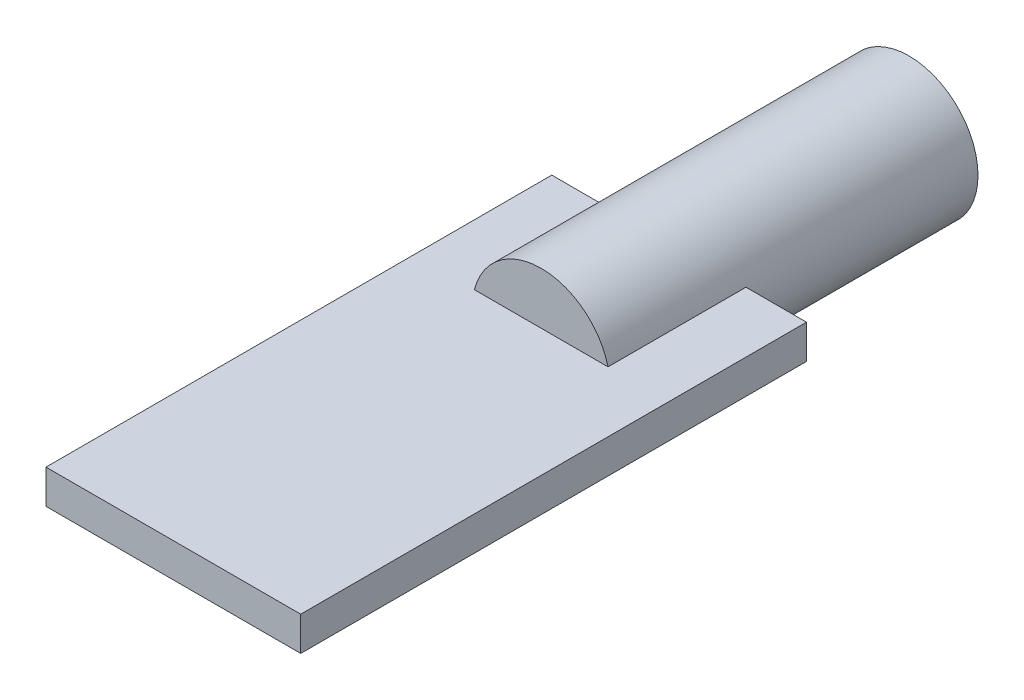
ISO-10303-21;
HEADER;
FILE_DESCRIPTION(('STEP AP214'),'2;1');
FILE_NAME('part.step','',(''),(''),'','','');
FILE_SCHEMA(('AUTOMOTIVE_DESIGN { 1 0 10303 214 1 1 1 1 }'));
ENDSEC;
DATA;
#1=APPLICATION_CONTEXT('core data for automotive mechanical design processes');
#2=APPLICATION_PROTOCOL_DEFINITION('international standard','automotive_design',2000,#1);
#3=PRODUCT_CONTEXT('',#1,'mechanical');
#4=PRODUCT('Part','Part','',(#3));
#5=PRODUCT_RELATED_PRODUCT_CATEGORY('part','',(#4));
#6=PRODUCT_DEFINITION_FORMATION('','',#4);
#7=PRODUCT_DEFINITION_CONTEXT('part definition',#1,'design');
#8=PRODUCT_DEFINITION('design','',#6,#7);
#9=PRODUCT_DEFINITION_SHAPE('','',#8);
#10=(LENGTH_UNIT() NAMED_UNIT(*) SI_UNIT(.MILLI.,.METRE.));
#11=(NAMED_UNIT(*) PLANE_ANGLE_UNIT() SI_UNIT($,.RADIAN.));
#12=(NAMED_UNIT(*) SI_UNIT($,.STERADIAN.) SOLID_ANGLE_UNIT());
#13=UNCERTAINTY_MEASURE_WITH_UNIT(LENGTH_MEASURE(1.E-05),#10,'distance_accuracy_value','');
#14=(GEOMETRIC_REPRESENTATION_CONTEXT(3) GLOBAL_UNCERTAINTY_ASSIGNED_CONTEXT((#13)) GLOBAL_UNIT_ASSIGNED_CONTEXT((#10,
#11,#12)) REPRESENTATION_CONTEXT('',''));
#15=CARTESIAN_POINT('',(0.,0.,0.));
#16=DIRECTION('',(0.,0.,1.));
#17=DIRECTION('',(1.,0.,0.));
#18=AXIS2_PLACEMENT_3D('',#15,#16,#17);
#19=CARTESIAN_POINT('',(0.,0.,40.));
#20=DIRECTION('',(0.,0.,1.));
#21=DIRECTION('',(1.,0.,0.));
#22=AXIS2_PLACEMENT_3D('',#19,#20,#21);
#23=PLANE('',#22);
#24=DIRECTION('',(1.,0.,0.));
#25=VECTOR('',#24,1.);
#26=CARTESIAN_POINT('',(0.,-1.85,40.));
#27=LINE('',#26,#25);
#28=CARTESIAN_POINT('',(-7.26825288497862,-1.85,40.));
#29=VERTEX_POINT('',#28);
#30=CARTESIAN_POINT('',(7.26825288497862,-1.85,40.));
#31=VERTEX_POINT('',#30);
#32=EDGE_CURVE('E144',#29,#31,#27,.T.);
#33=ORIENTED_EDGE('',*,*,#32,.F.);
#34=CARTESIAN_POINT('',(0.,0.,40.));
#35=DIRECTION('',(0.,0.,1.));
#36=DIRECTION('',(1.,0.,0.));
#37=AXIS2_PLACEMENT_3D('',#34,#35,#36);
#38=CIRCLE('',#37,7.5);
#39=EDGE_CURVE('E141',#29,#31,#38,.T.);
#40=ORIENTED_EDGE('',*,*,#39,.T.);
#41=EDGE_LOOP('',(#33,#40));
#42=FACE_BOUND('',#41,.T.);
#43=ADVANCED_FACE('F35',(#42),#23,.T.);
#44=CARTESIAN_POINT('',(0.,0.,40.));
#45=DIRECTION('',(0.,0.,-1.));
#46=DIRECTION('',(-1.,0.,0.));
#47=AXIS2_PLACEMENT_3D('',#44,#45,#46);
#48=CYLINDRICAL_SURFACE('',#47,7.5);
#49=CARTESIAN_POINT('',(0.,0.,25.));
#50=DIRECTION('',(0.,0.,-1.));
#51=DIRECTION('',(-1.,0.,0.));
#52=AXIS2_PLACEMENT_3D('',#49,#50,#51);
#53=CIRCLE('',#52,7.5);
#54=CARTESIAN_POINT('',(7.26825288497862,1.85,25.));
#55=VERTEX_POINT('',#54);
#56=CARTESIAN_POINT('',(7.26825288497862,-1.85,25.));
#57=VERTEX_POINT('',#56);
#58=EDGE_CURVE('E11',#55,#57,#53,.T.);
#59=ORIENTED_EDGE('',*,*,#58,.T.);
#60=DIRECTION('',(0.,0.,-1.));
#61=VECTOR('',#60,1.);
#62=CARTESIAN_POINT('',(7.26825288497862,-1.85,40.));
#63=LINE('',#62,#61);
#64=EDGE_CURVE('E134',#57,#31,#63,.F.);
#65=ORIENTED_EDGE('',*,*,#64,.T.);
#66=ORIENTED_EDGE('',*,*,#39,.F.);
#67=DIRECTION('',(0.,0.,-1.));
#68=VECTOR('',#67,1.);
#69=CARTESIAN_POINT('',(-7.26825288497862,-1.85,40.));
#70=LINE('',#69,#68);
#71=CARTESIAN_POINT('',(-7.26825288497862,-1.85,25.));
#72=VERTEX_POINT('',#71);
#73=EDGE_CURVE('E136',#29,#72,#70,.T.);
#74=ORIENTED_EDGE('',*,*,#73,.T.);
#75=CARTESIAN_POINT('',(-7.26825288497862,1.85,25.));
#76=VERTEX_POINT('',#75);
#77=EDGE_CURVE('E39',#72,#76,#53,.T.);
#78=ORIENTED_EDGE('',*,*,#77,.T.);
#79=DIRECTION('',(0.,0.,-1.));
#80=VECTOR('',#79,1.);
#81=CARTESIAN_POINT('',(-7.26825288497862,1.85,40.));
#82=LINE('',#81,#80);
#83=CARTESIAN_POINT('',(-7.26825288497862,1.85,40.));
#84=VERTEX_POINT('',#83);
#85=EDGE_CURVE('E124',#76,#84,#82,.F.);
#86=ORIENTED_EDGE('',*,*,#85,.T.);
#87=CARTESIAN_POINT('',(7.26825288497862,1.85,40.));
#88=VERTEX_POINT('',#87);
#89=EDGE_CURVE('E139',#88,#84,#38,.T.);
#90=ORIENTED_EDGE('',*,*,#89,.F.);
#91=DIRECTION('',(0.,0.,-1.));
#92=VECTOR('',#91,1.);
#93=CARTESIAN_POINT('',(7.26825288497862,1.85,40.));
#94=LINE('',#93,#92);
#95=EDGE_CURVE('E127',#88,#55,#94,.T.);
#96=ORIENTED_EDGE('',*,*,#95,.T.);
#97=EDGE_LOOP('',(#59,#65,#66,#74,#78,#86,#90,#96));
#98=FACE_BOUND('',#97,.T.);
#99=CARTESIAN_POINT('',(0.,0.,0.));
#100=DIRECTION('',(0.,0.,1.));
#101=DIRECTION('',(1.,0.,0.));
#102=AXIS2_PLACEMENT_3D('',#99,#100,#101);
#103=CIRCLE('',#102,7.5);
#104=CARTESIAN_POINT('',(7.5,0.,0.));
#105=VERTEX_POINT('',#104);
#106=EDGE_CURVE('E138',#105,#105,#103,.T.);
#107=ORIENTED_EDGE('',*,*,#106,.T.);
#108=EDGE_LOOP('',(#107));
#109=FACE_BOUND('',#108,.T.);
#110=ADVANCED_FACE('F37',(#98,#109),#48,.T.);
#111=DIRECTION('',(-1.,0.,0.));
#112=VECTOR('',#111,1.);
#113=CARTESIAN_POINT('',(0.,1.85,40.));
#114=LINE('',#113,#112);
#115=EDGE_CURVE('E49',#88,#84,#114,.T.);
#116=ORIENTED_EDGE('',*,*,#115,.F.);
#117=ORIENTED_EDGE('',*,*,#89,.T.);
#118=EDGE_LOOP('',(#116,#117));
#119=FACE_BOUND('',#118,.T.);
#120=ADVANCED_FACE('F189',(#119),#23,.T.);
#121=CARTESIAN_POINT('',(0.,0.,0.));
#122=DIRECTION('',(0.,0.,1.));
#123=DIRECTION('',(1.,0.,0.));
#124=AXIS2_PLACEMENT_3D('',#121,#122,#123);
#125=PLANE('',#124);
#126=ORIENTED_EDGE('',*,*,#106,.F.);
#127=EDGE_LOOP('',(#126));
#128=FACE_BOUND('',#127,.T.);
#129=ADVANCED_FACE('F194',(#128),#125,.F.);
#130=CARTESIAN_POINT('',(-13.85,1.85,80.));
#131=DIRECTION('',(0.,-1.,0.));
#132=DIRECTION('',(0.,0.,-1.));
#133=AXIS2_PLACEMENT_3D('',#130,#131,#132);
#134=PLANE('',#133);
#135=ORIENTED_EDGE('',*,*,#115,.T.);
#136=ORIENTED_EDGE('',*,*,#85,.F.);
#137=DIRECTION('',(-1.,0.,0.));
#138=VECTOR('',#137,1.);
#139=CARTESIAN_POINT('',(-13.85,1.85,25.));
#140=LINE('',#139,#138);
#141=CARTESIAN_POINT('',(-13.85,1.85,25.));
#142=VERTEX_POINT('',#141);
#143=EDGE_CURVE('E156',#76,#142,#140,.T.);
#144=ORIENTED_EDGE('',*,*,#143,.T.);
#145=DIRECTION('',(0.,0.,-1.));
#146=VECTOR('',#145,1.);
#147=CARTESIAN_POINT('',(-13.85,1.85,80.));
#148=LINE('',#147,#146);
#149=CARTESIAN_POINT('',(-13.85,1.85,80.));
#150=VERTEX_POINT('',#149);
#151=EDGE_CURVE('E106',#150,#142,#148,.T.);
#152=ORIENTED_EDGE('',*,*,#151,.F.);
#153=DIRECTION('',(-1.,0.,0.));
#154=VECTOR('',#153,1.);
#155=CARTESIAN_POINT('',(-13.85,1.85,80.));
#156=LINE('',#155,#154);
#157=CARTESIAN_POINT('',(13.85,1.85,80.));
#158=VERTEX_POINT('',#157);
#159=EDGE_CURVE('E98',#158,#150,#156,.T.);
#160=ORIENTED_EDGE('',*,*,#159,.F.);
#161=DIRECTION('',(0.,0.,-1.));
#162=VECTOR('',#161,1.);
#163=CARTESIAN_POINT('',(13.85,1.85,80.));
#164=LINE('',#163,#162);
#165=CARTESIAN_POINT('',(13.85,1.85,25.));
#166=VERTEX_POINT('',#165);
#167=EDGE_CURVE('E103',#158,#166,#164,.T.);
#168=ORIENTED_EDGE('',*,*,#167,.T.);
#169=EDGE_CURVE('E161',#166,#55,#140,.T.);
#170=ORIENTED_EDGE('',*,*,#169,.T.);
#171=ORIENTED_EDGE('',*,*,#95,.F.);
#172=EDGE_LOOP('',(#135,#136,#144,#152,#160,#168,#170,#171));
#173=FACE_BOUND('',#172,.T.);
#174=ADVANCED_FACE('F100',(#173),#134,.F.);
#175=CARTESIAN_POINT('',(-13.85,-1.85,80.));
#176=DIRECTION('',(0.,1.,0.));
#177=DIRECTION('',(0.,0.,1.));
#178=AXIS2_PLACEMENT_3D('',#175,#176,#177);
#179=PLANE('',#178);
#180=ORIENTED_EDGE('',*,*,#32,.T.);
#181=ORIENTED_EDGE('',*,*,#64,.F.);
#182=DIRECTION('',(1.,0.,0.));
#183=VECTOR('',#182,1.);
#184=CARTESIAN_POINT('',(-13.85,-1.85,25.));
#185=LINE('',#184,#183);
#186=CARTESIAN_POINT('',(13.85,-1.85,25.));
#187=VERTEX_POINT('',#186);
#188=EDGE_CURVE('E167',#57,#187,#185,.T.);
#189=ORIENTED_EDGE('',*,*,#188,.T.);
#190=DIRECTION('',(0.,0.,-1.));
#191=VECTOR('',#190,1.);
#192=CARTESIAN_POINT('',(13.85,-1.85,80.));
#193=LINE('',#192,#191);
#194=CARTESIAN_POINT('',(13.85,-1.85,80.));
#195=VERTEX_POINT('',#194);
#196=EDGE_CURVE('E169',#195,#187,#193,.T.);
#197=ORIENTED_EDGE('',*,*,#196,.F.);
#198=DIRECTION('',(1.,0.,0.));
#199=VECTOR('',#198,1.);
#200=CARTESIAN_POINT('',(-13.85,-1.85,80.));
#201=LINE('',#200,#199);
#202=CARTESIAN_POINT('',(-13.85,-1.85,80.));
#203=VERTEX_POINT('',#202);
#204=EDGE_CURVE('E115',#203,#195,#201,.T.);
#205=ORIENTED_EDGE('',*,*,#204,.F.);
#206=DIRECTION('',(0.,0.,-1.));
#207=VECTOR('',#206,1.);
#208=CARTESIAN_POINT('',(-13.85,-1.85,80.));
#209=LINE('',#208,#207);
#210=CARTESIAN_POINT('',(-13.85,-1.85,25.));
#211=VERTEX_POINT('',#210);
#212=EDGE_CURVE('E129',#203,#211,#209,.T.);
#213=ORIENTED_EDGE('',*,*,#212,.T.);
#214=EDGE_CURVE('E119',#211,#72,#185,.T.);
#215=ORIENTED_EDGE('',*,*,#214,.T.);
#216=ORIENTED_EDGE('',*,*,#73,.F.);
#217=EDGE_LOOP('',(#180,#181,#189,#197,#205,#213,#215,#216));
#218=FACE_BOUND('',#217,.T.);
#219=ADVANCED_FACE('F172',(#218),#179,.F.);
#220=CARTESIAN_POINT('',(0.,0.,25.));
#221=DIRECTION('',(0.,0.,-1.));
#222=DIRECTION('',(-1.,0.,0.));
#223=AXIS2_PLACEMENT_3D('',#220,#221,#222);
#224=PLANE('',#223);
#225=ORIENTED_EDGE('',*,*,#58,.F.);
#226=ORIENTED_EDGE('',*,*,#169,.F.);
#227=DIRECTION('',(0.,1.,0.));
#228=VECTOR('',#227,1.);
#229=CARTESIAN_POINT('',(13.85,-1.85,25.));
#230=LINE('',#229,#228);
#231=EDGE_CURVE('E123',#187,#166,#230,.T.);
#232=ORIENTED_EDGE('',*,*,#231,.F.);
#233=ORIENTED_EDGE('',*,*,#188,.F.);
#234=EDGE_LOOP('',(#225,#226,#232,#233));
#235=FACE_BOUND('',#234,.T.);
#236=ADVANCED_FACE('F206',(#235),#224,.T.);
#237=ORIENTED_EDGE('',*,*,#77,.F.);
#238=ORIENTED_EDGE('',*,*,#214,.F.);
#239=DIRECTION('',(0.,-1.,0.));
#240=VECTOR('',#239,1.);
#241=CARTESIAN_POINT('',(-13.85,-1.85,25.));
#242=LINE('',#241,#240);
#243=EDGE_CURVE('E160',#142,#211,#242,.T.);
#244=ORIENTED_EDGE('',*,*,#243,.F.);
#245=ORIENTED_EDGE('',*,*,#143,.F.);
#246=EDGE_LOOP('',(#237,#238,#244,#245));
#247=FACE_BOUND('',#246,.T.);
#248=ADVANCED_FACE('F159',(#247),#224,.T.);
#249=CARTESIAN_POINT('',(13.85,-1.85,80.));
#250=DIRECTION('',(-1.,0.,0.));
#251=DIRECTION('',(0.,0.,1.));
#252=AXIS2_PLACEMENT_3D('',#249,#250,#251);
#253=PLANE('',#252);
#254=ORIENTED_EDGE('',*,*,#231,.T.);
#255=ORIENTED_EDGE('',*,*,#167,.F.);
#256=DIRECTION('',(0.,1.,0.));
#257=VECTOR('',#256,1.);
#258=CARTESIAN_POINT('',(13.85,-1.85,80.));
#259=LINE('',#258,#257);
#260=EDGE_CURVE('E110',#195,#158,#259,.T.);
#261=ORIENTED_EDGE('',*,*,#260,.F.);
#262=ORIENTED_EDGE('',*,*,#196,.T.);
#263=EDGE_LOOP('',(#254,#255,#261,#262));
#264=FACE_BOUND('',#263,.T.);
#265=ADVANCED_FACE('F121',(#264),#253,.F.);
#266=CARTESIAN_POINT('',(-13.85,-1.85,80.));
#267=DIRECTION('',(1.,0.,0.));
#268=DIRECTION('',(0.,0.,-1.));
#269=AXIS2_PLACEMENT_3D('',#266,#267,#268);
#270=PLANE('',#269);
#271=ORIENTED_EDGE('',*,*,#243,.T.);
#272=ORIENTED_EDGE('',*,*,#212,.F.);
#273=DIRECTION('',(0.,-1.,0.));
#274=VECTOR('',#273,1.);
#275=CARTESIAN_POINT('',(-13.85,-1.85,80.));
#276=LINE('',#275,#274);
#277=EDGE_CURVE('E109',#150,#203,#276,.T.);
#278=ORIENTED_EDGE('',*,*,#277,.F.);
#279=ORIENTED_EDGE('',*,*,#151,.T.);
#280=EDGE_LOOP('',(#271,#272,#278,#279));
#281=FACE_BOUND('',#280,.T.);
#282=ADVANCED_FACE('F174',(#281),#270,.F.);
#283=CARTESIAN_POINT('',(0.,0.,80.));
#284=DIRECTION('',(0.,0.,-1.));
#285=DIRECTION('',(-1.,0.,0.));
#286=AXIS2_PLACEMENT_3D('',#283,#284,#285);
#287=PLANE('',#286);
#288=ORIENTED_EDGE('',*,*,#260,.T.);
#289=ORIENTED_EDGE('',*,*,#159,.T.);
#290=ORIENTED_EDGE('',*,*,#277,.T.);
#291=ORIENTED_EDGE('',*,*,#204,.T.);
#292=EDGE_LOOP('',(#288,#289,#290,#291));
#293=FACE_BOUND('',#292,.T.);
#294=ADVANCED_FACE('F113',(#293),#287,.F.);
#295=CLOSED_SHELL('',(#43,#110,#120,#129,#174,#219,#236,#248,#265,#282,#294));
#296=MANIFOLD_SOLID_BREP('B2',#295);
#297=ADVANCED_BREP_SHAPE_REPRESENTATION('',(#18,#296),#14);
#298=SHAPE_DEFINITION_REPRESENTATION(#9,#297);
ENDSEC;
END-ISO-10303-21;
